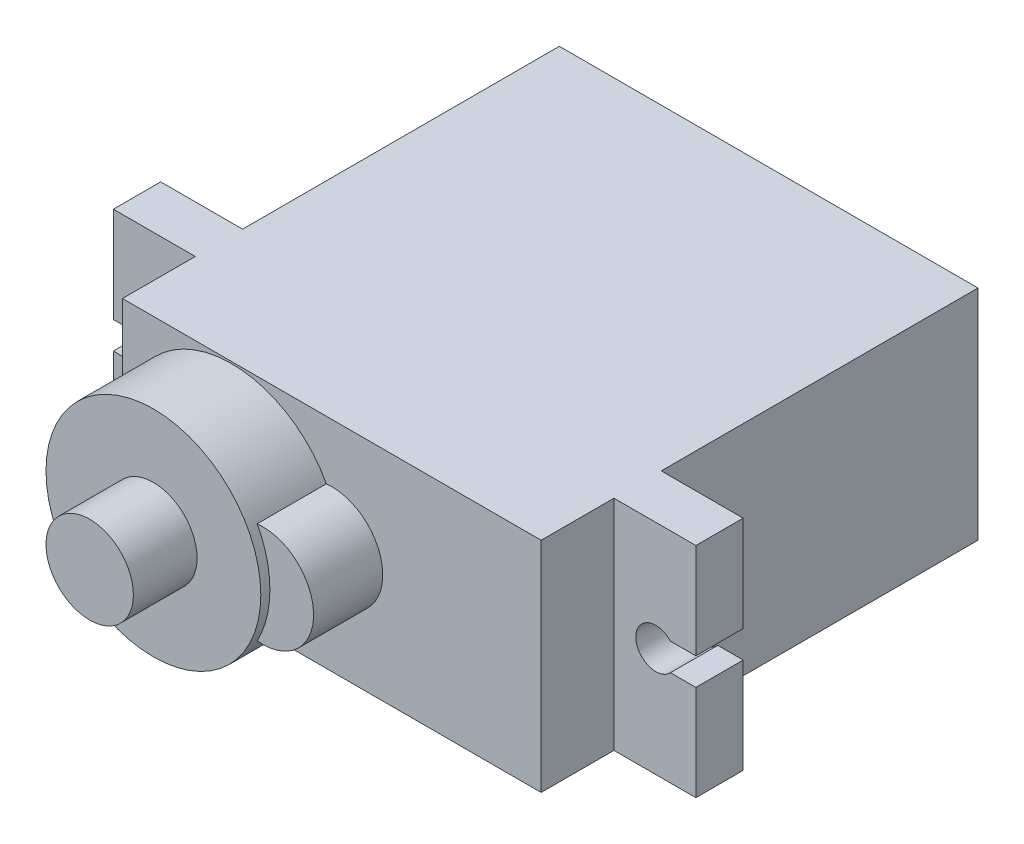
ISO-10303-21;
HEADER;
FILE_DESCRIPTION(('STEP AP214'),'2;1');
FILE_NAME('part.step','',(''),(''),'','','');
FILE_SCHEMA(('AUTOMOTIVE_DESIGN { 1 0 10303 214 1 1 1 1 }'));
ENDSEC;
DATA;
#1=APPLICATION_CONTEXT('core data for automotive mechanical design processes');
#2=APPLICATION_PROTOCOL_DEFINITION('international standard','automotive_design',2000,#1);
#3=PRODUCT_CONTEXT('',#1,'mechanical');
#4=PRODUCT('Part','Part','',(#3));
#5=PRODUCT_RELATED_PRODUCT_CATEGORY('part','',(#4));
#6=PRODUCT_DEFINITION_FORMATION('','',#4);
#7=PRODUCT_DEFINITION_CONTEXT('part definition',#1,'design');
#8=PRODUCT_DEFINITION('design','',#6,#7);
#9=PRODUCT_DEFINITION_SHAPE('','',#8);
#10=(LENGTH_UNIT() NAMED_UNIT(*) SI_UNIT(.MILLI.,.METRE.));
#11=(NAMED_UNIT(*) PLANE_ANGLE_UNIT() SI_UNIT($,.RADIAN.));
#12=(NAMED_UNIT(*) SI_UNIT($,.STERADIAN.) SOLID_ANGLE_UNIT());
#13=UNCERTAINTY_MEASURE_WITH_UNIT(LENGTH_MEASURE(1.E-05),#10,'distance_accuracy_value','');
#14=(GEOMETRIC_REPRESENTATION_CONTEXT(3) GLOBAL_UNCERTAINTY_ASSIGNED_CONTEXT((#13)) GLOBAL_UNIT_ASSIGNED_CONTEXT((#10,
#11,#12)) REPRESENTATION_CONTEXT('',''));
#15=CARTESIAN_POINT('',(0.,0.,0.));
#16=DIRECTION('',(0.,0.,1.));
#17=DIRECTION('',(1.,0.,0.));
#18=AXIS2_PLACEMENT_3D('',#15,#16,#17);
#19=CARTESIAN_POINT('',(0.,0.,31.8));
#20=DIRECTION('',(0.,0.,1.));
#21=DIRECTION('',(1.,0.,0.));
#22=AXIS2_PLACEMENT_3D('',#19,#20,#21);
#23=PLANE('',#22);
#24=CARTESIAN_POINT('',(0.,0.,31.8));
#25=DIRECTION('',(0.,0.,1.));
#26=DIRECTION('',(1.,0.,0.));
#27=AXIS2_PLACEMENT_3D('',#24,#25,#26);
#28=CIRCLE('',#27,2.4);
#29=CARTESIAN_POINT('',(2.4,0.,31.8));
#30=VERTEX_POINT('',#29);
#31=EDGE_CURVE('E11',#30,#30,#28,.T.);
#32=ORIENTED_EDGE('',*,*,#31,.T.);
#33=EDGE_LOOP('',(#32));
#34=FACE_BOUND('',#33,.T.);
#35=ADVANCED_FACE('F17',(#34),#23,.T.);
#36=CARTESIAN_POINT('',(0.,0.,28.3));
#37=DIRECTION('',(0.,0.,1.));
#38=DIRECTION('',(1.,0.,0.));
#39=AXIS2_PLACEMENT_3D('',#36,#37,#38);
#40=CYLINDRICAL_SURFACE('',#39,2.4);
#41=ORIENTED_EDGE('',*,*,#31,.F.);
#42=EDGE_LOOP('',(#41));
#43=FACE_BOUND('',#42,.T.);
#44=CARTESIAN_POINT('',(0.,0.,28.3));
#45=DIRECTION('',(0.,0.,1.));
#46=DIRECTION('',(1.,0.,0.));
#47=AXIS2_PLACEMENT_3D('',#44,#45,#46);
#48=CIRCLE('',#47,2.4);
#49=CARTESIAN_POINT('',(2.4,0.,28.3));
#50=VERTEX_POINT('',#49);
#51=EDGE_CURVE('E26',#50,#50,#48,.T.);
#52=ORIENTED_EDGE('',*,*,#51,.T.);
#53=EDGE_LOOP('',(#52));
#54=FACE_BOUND('',#53,.T.);
#55=ADVANCED_FACE('F610',(#43,#54),#40,.T.);
#56=CARTESIAN_POINT('',(0.,0.,28.3));
#57=DIRECTION('',(0.,0.,1.));
#58=DIRECTION('',(1.,0.,0.));
#59=AXIS2_PLACEMENT_3D('',#56,#57,#58);
#60=PLANE('',#59);
#61=ORIENTED_EDGE('',*,*,#51,.F.);
#62=EDGE_LOOP('',(#61));
#63=FACE_BOUND('',#62,.T.);
#64=CARTESIAN_POINT('',(0.,0.,28.3));
#65=DIRECTION('',(0.,0.,1.));
#66=DIRECTION('',(1.,0.,0.));
#67=AXIS2_PLACEMENT_3D('',#64,#65,#66);
#68=CIRCLE('',#67,5.9);
#69=CARTESIAN_POINT('',(5.9,0.,28.3));
#70=VERTEX_POINT('',#69);
#71=EDGE_CURVE('E445',#70,#70,#68,.T.);
#72=ORIENTED_EDGE('',*,*,#71,.T.);
#73=EDGE_LOOP('',(#72));
#74=FACE_BOUND('',#73,.T.);
#75=ADVANCED_FACE('F616',(#63,#74),#60,.T.);
#76=CARTESIAN_POINT('',(5.5,0.,27.8));
#77=DIRECTION('',(0.,0.,1.));
#78=DIRECTION('',(1.,0.,0.));
#79=AXIS2_PLACEMENT_3D('',#76,#77,#78);
#80=PLANE('',#79);
#81=CARTESIAN_POINT('',(0.,0.,27.8));
#82=DIRECTION('',(0.,0.,1.));
#83=DIRECTION('',(1.,0.,0.));
#84=AXIS2_PLACEMENT_3D('',#81,#82,#83);
#85=CIRCLE('',#84,5.9);
#86=CARTESIAN_POINT('',(5.201818181818,-2.784077513882,27.8));
#87=VERTEX_POINT('',#86);
#88=CARTESIAN_POINT('',(5.201818181818,2.784077513882,27.8));
#89=VERTEX_POINT('',#88);
#90=EDGE_CURVE('E38',#87,#89,#85,.T.);
#91=ORIENTED_EDGE('',*,*,#90,.F.);
#92=CARTESIAN_POINT('',(5.5,0.,27.8));
#93=DIRECTION('',(0.,0.,-1.));
#94=DIRECTION('',(-0.106493506494011,0.9943133978151,0.));
#95=AXIS2_PLACEMENT_3D('',#92,#93,#94);
#96=CIRCLE('',#95,2.8);
#97=EDGE_CURVE('E43',#89,#87,#96,.T.);
#98=ORIENTED_EDGE('',*,*,#97,.F.);
#99=EDGE_LOOP('',(#91,#98));
#100=FACE_BOUND('',#99,.T.);
#101=ADVANCED_FACE('F624',(#100),#80,.T.);
#102=CARTESIAN_POINT('',(19.3,-0.75,16.4));
#103=DIRECTION('',(0.,1.,0.));
#104=DIRECTION('',(1.,0.,0.));
#105=AXIS2_PLACEMENT_3D('',#102,#103,#104);
#106=PLANE('',#105);
#107=DIRECTION('',(-1.,0.,0.));
#108=VECTOR('',#107,1.);
#109=CARTESIAN_POINT('',(4.4,-0.75,20.));
#110=LINE('',#109,#108);
#111=CARTESIAN_POINT('',(21.5,-0.75,20.));
#112=VERTEX_POINT('',#111);
#113=CARTESIAN_POINT('',(20.104673846972,-0.75,20.));
#114=VERTEX_POINT('',#113);
#115=EDGE_CURVE('E438',#112,#114,#110,.T.);
#116=ORIENTED_EDGE('',*,*,#115,.F.);
#117=DIRECTION('',(0.,0.,1.));
#118=VECTOR('',#117,1.);
#119=CARTESIAN_POINT('',(21.5,-0.75,16.9));
#120=LINE('',#119,#118);
#121=CARTESIAN_POINT('',(21.5,-0.75,17.4));
#122=VERTEX_POINT('',#121);
#123=EDGE_CURVE('E387',#122,#112,#120,.T.);
#124=ORIENTED_EDGE('',*,*,#123,.F.);
#125=DIRECTION('',(-1.,0.,0.));
#126=VECTOR('',#125,1.);
#127=CARTESIAN_POINT('',(4.4,-0.75,17.4));
#128=LINE('',#127,#126);
#129=CARTESIAN_POINT('',(20.104673846972,-0.75,17.4));
#130=VERTEX_POINT('',#129);
#131=EDGE_CURVE('E359',#122,#130,#128,.T.);
#132=ORIENTED_EDGE('',*,*,#131,.T.);
#133=DIRECTION('',(0.,0.,-1.));
#134=VECTOR('',#133,1.);
#135=CARTESIAN_POINT('',(20.104673846972,-0.75,16.4));
#136=LINE('',#135,#134);
#137=EDGE_CURVE('E376',#114,#130,#136,.T.);
#138=ORIENTED_EDGE('',*,*,#137,.F.);
#139=EDGE_LOOP('',(#116,#124,#132,#138));
#140=FACE_BOUND('',#139,.T.);
#141=ADVANCED_FACE('F646',(#140),#106,.T.);
#142=CARTESIAN_POINT('',(19.3,0.,16.4));
#143=DIRECTION('',(0.,0.,-1.));
#144=DIRECTION('',(1.,0.,0.));
#145=AXIS2_PLACEMENT_3D('',#142,#143,#144);
#146=CYLINDRICAL_SURFACE('',#145,1.1);
#147=ORIENTED_EDGE('',*,*,#137,.T.);
#148=CARTESIAN_POINT('',(19.3,0.,17.4));
#149=DIRECTION('',(0.,0.,-1.));
#150=DIRECTION('',(1.,0.,0.));
#151=AXIS2_PLACEMENT_3D('',#148,#149,#150);
#152=CIRCLE('',#151,1.1);
#153=CARTESIAN_POINT('',(20.104673846972,0.75,17.4));
#154=VERTEX_POINT('',#153);
#155=EDGE_CURVE('E364',#130,#154,#152,.T.);
#156=ORIENTED_EDGE('',*,*,#155,.T.);
#157=DIRECTION('',(0.,0.,-1.));
#158=VECTOR('',#157,1.);
#159=CARTESIAN_POINT('',(20.104673846972,0.75,16.4));
#160=LINE('',#159,#158);
#161=CARTESIAN_POINT('',(20.104673846972,0.75,20.));
#162=VERTEX_POINT('',#161);
#163=EDGE_CURVE('E20',#162,#154,#160,.T.);
#164=ORIENTED_EDGE('',*,*,#163,.F.);
#165=CARTESIAN_POINT('',(19.3,0.,20.));
#166=DIRECTION('',(0.,0.,-1.));
#167=DIRECTION('',(1.,0.,0.));
#168=AXIS2_PLACEMENT_3D('',#165,#166,#167);
#169=CIRCLE('',#168,1.1);
#170=EDGE_CURVE('E479',#114,#162,#169,.T.);
#171=ORIENTED_EDGE('',*,*,#170,.F.);
#172=EDGE_LOOP('',(#147,#156,#164,#171));
#173=FACE_BOUND('',#172,.T.);
#174=ADVANCED_FACE('F642',(#173),#146,.F.);
#175=CARTESIAN_POINT('',(19.3,0.75,16.4));
#176=DIRECTION('',(0.,1.,0.));
#177=DIRECTION('',(1.,0.,0.));
#178=AXIS2_PLACEMENT_3D('',#175,#176,#177);
#179=PLANE('',#178);
#180=ORIENTED_EDGE('',*,*,#163,.T.);
#181=DIRECTION('',(-1.,0.,0.));
#182=VECTOR('',#181,1.);
#183=CARTESIAN_POINT('',(4.4,0.75,17.4));
#184=LINE('',#183,#182);
#185=CARTESIAN_POINT('',(21.5,0.75,17.4));
#186=VERTEX_POINT('',#185);
#187=EDGE_CURVE('E386',#186,#154,#184,.T.);
#188=ORIENTED_EDGE('',*,*,#187,.F.);
#189=DIRECTION('',(0.,0.,1.));
#190=VECTOR('',#189,1.);
#191=CARTESIAN_POINT('',(21.5,0.75,16.9));
#192=LINE('',#191,#190);
#193=CARTESIAN_POINT('',(21.5,0.75,20.));
#194=VERTEX_POINT('',#193);
#195=EDGE_CURVE('E315',#186,#194,#192,.T.);
#196=ORIENTED_EDGE('',*,*,#195,.T.);
#197=DIRECTION('',(-1.,0.,0.));
#198=VECTOR('',#197,1.);
#199=CARTESIAN_POINT('',(4.4,0.75,20.));
#200=LINE('',#199,#198);
#201=EDGE_CURVE('E414',#194,#162,#200,.T.);
#202=ORIENTED_EDGE('',*,*,#201,.T.);
#203=EDGE_LOOP('',(#180,#188,#196,#202));
#204=FACE_BOUND('',#203,.T.);
#205=ADVANCED_FACE('F637',(#204),#179,.F.);
#206=CARTESIAN_POINT('',(5.5,0.,24.));
#207=DIRECTION('',(0.,0.,1.));
#208=DIRECTION('',(1.,0.,0.));
#209=AXIS2_PLACEMENT_3D('',#206,#207,#208);
#210=CYLINDRICAL_SURFACE('',#209,2.8);
#211=CARTESIAN_POINT('',(5.5,0.,24.));
#212=DIRECTION('',(0.,0.,-1.));
#213=DIRECTION('',(-0.106493506493022,0.994313397815206,0.));
#214=AXIS2_PLACEMENT_3D('',#211,#212,#213);
#215=CIRCLE('',#214,2.8);
#216=CARTESIAN_POINT('',(5.201818181818,2.784077513882,24.));
#217=VERTEX_POINT('',#216);
#218=CARTESIAN_POINT('',(5.201818181818,-2.784077513882,24.));
#219=VERTEX_POINT('',#218);
#220=EDGE_CURVE('E295',#217,#219,#215,.T.);
#221=ORIENTED_EDGE('',*,*,#220,.F.);
#222=DIRECTION('',(0.,0.,1.));
#223=VECTOR('',#222,1.);
#224=CARTESIAN_POINT('',(5.201818181818,2.784077513882,24.));
#225=LINE('',#224,#223);
#226=EDGE_CURVE('E338',#217,#89,#225,.T.);
#227=ORIENTED_EDGE('',*,*,#226,.T.);
#228=ORIENTED_EDGE('',*,*,#97,.T.);
#229=DIRECTION('',(0.,0.,1.));
#230=VECTOR('',#229,1.);
#231=CARTESIAN_POINT('',(5.201818181818,-2.784077513882,24.));
#232=LINE('',#231,#230);
#233=EDGE_CURVE('E337',#219,#87,#232,.T.);
#234=ORIENTED_EDGE('',*,*,#233,.F.);
#235=EDGE_LOOP('',(#221,#227,#228,#234));
#236=FACE_BOUND('',#235,.T.);
#237=ADVANCED_FACE('F555',(#236),#210,.T.);
#238=CARTESIAN_POINT('',(0.,0.,24.));
#239=DIRECTION('',(0.,0.,1.));
#240=DIRECTION('',(1.,0.,0.));
#241=AXIS2_PLACEMENT_3D('',#238,#239,#240);
#242=CYLINDRICAL_SURFACE('',#241,5.9);
#243=ORIENTED_EDGE('',*,*,#71,.F.);
#244=EDGE_LOOP('',(#243));
#245=FACE_BOUND('',#244,.T.);
#246=ORIENTED_EDGE('',*,*,#233,.T.);
#247=ORIENTED_EDGE('',*,*,#90,.T.);
#248=ORIENTED_EDGE('',*,*,#226,.F.);
#249=CARTESIAN_POINT('',(0.,0.,24.));
#250=DIRECTION('',(0.,0.,1.));
#251=DIRECTION('',(1.,0.,0.));
#252=AXIS2_PLACEMENT_3D('',#249,#250,#251);
#253=CIRCLE('',#252,5.9);
#254=EDGE_CURVE('E527',#217,#219,#253,.T.);
#255=ORIENTED_EDGE('',*,*,#254,.T.);
#256=EDGE_LOOP('',(#246,#247,#248,#255));
#257=FACE_BOUND('',#256,.T.);
#258=ADVANCED_FACE('F551',(#245,#257),#242,.T.);
#259=CARTESIAN_POINT('',(-9.25,-2.25,1.5));
#260=DIRECTION('',(1.,0.,0.));
#261=DIRECTION('',(0.,1.,0.));
#262=AXIS2_PLACEMENT_3D('',#259,#260,#261);
#263=PLANE('',#262);
#264=DIRECTION('',(0.,1.,0.));
#265=VECTOR('',#264,1.);
#266=CARTESIAN_POINT('',(-9.25,-2.25,4.5));
#267=LINE('',#266,#265);
#268=CARTESIAN_POINT('',(-9.25,-2.25,4.5));
#269=VERTEX_POINT('',#268);
#270=CARTESIAN_POINT('',(-9.25,2.25,4.5));
#271=VERTEX_POINT('',#270);
#272=EDGE_CURVE('E501',#269,#271,#267,.T.);
#273=ORIENTED_EDGE('',*,*,#272,.T.);
#274=DIRECTION('',(0.,0.,1.));
#275=VECTOR('',#274,1.);
#276=CARTESIAN_POINT('',(-9.25,2.25,1.5));
#277=LINE('',#276,#275);
#278=CARTESIAN_POINT('',(-9.25,2.25,1.5));
#279=VERTEX_POINT('',#278);
#280=EDGE_CURVE('E489',#279,#271,#277,.T.);
#281=ORIENTED_EDGE('',*,*,#280,.F.);
#282=DIRECTION('',(0.,1.,0.));
#283=VECTOR('',#282,1.);
#284=CARTESIAN_POINT('',(-9.25,-2.25,1.5));
#285=LINE('',#284,#283);
#286=CARTESIAN_POINT('',(-9.25,-2.25,1.5));
#287=VERTEX_POINT('',#286);
#288=EDGE_CURVE('E478',#287,#279,#285,.T.);
#289=ORIENTED_EDGE('',*,*,#288,.F.);
#290=DIRECTION('',(0.,0.,1.));
#291=VECTOR('',#290,1.);
#292=CARTESIAN_POINT('',(-9.25,-2.25,1.5));
#293=LINE('',#292,#291);
#294=EDGE_CURVE('E369',#287,#269,#293,.T.);
#295=ORIENTED_EDGE('',*,*,#294,.T.);
#296=EDGE_LOOP('',(#273,#281,#289,#295));
#297=FACE_BOUND('',#296,.T.);
#298=ADVANCED_FACE('F606',(#297),#263,.F.);
#299=CARTESIAN_POINT('',(21.5,-6.,17.4));
#300=DIRECTION('',(1.,0.,0.));
#301=DIRECTION('',(0.,1.,0.));
#302=AXIS2_PLACEMENT_3D('',#299,#300,#301);
#303=PLANE('',#302);
#304=DIRECTION('',(0.,1.,0.));
#305=VECTOR('',#304,1.);
#306=CARTESIAN_POINT('',(21.5,-6.,20.));
#307=LINE('',#306,#305);
#308=CARTESIAN_POINT('',(21.5,6.,20.));
#309=VERTEX_POINT('',#308);
#310=EDGE_CURVE('E411',#194,#309,#307,.T.);
#311=ORIENTED_EDGE('',*,*,#310,.F.);
#312=ORIENTED_EDGE('',*,*,#195,.F.);
#313=DIRECTION('',(0.,1.,0.));
#314=VECTOR('',#313,1.);
#315=CARTESIAN_POINT('',(21.5,-6.,17.4));
#316=LINE('',#315,#314);
#317=CARTESIAN_POINT('',(21.5,6.,17.4));
#318=VERTEX_POINT('',#317);
#319=EDGE_CURVE('E383',#186,#318,#316,.T.);
#320=ORIENTED_EDGE('',*,*,#319,.T.);
#321=DIRECTION('',(0.,0.,1.));
#322=VECTOR('',#321,1.);
#323=CARTESIAN_POINT('',(21.5,6.,17.4));
#324=LINE('',#323,#322);
#325=EDGE_CURVE('E460',#318,#309,#324,.T.);
#326=ORIENTED_EDGE('',*,*,#325,.T.);
#327=EDGE_LOOP('',(#311,#312,#320,#326));
#328=FACE_BOUND('',#327,.T.);
#329=ADVANCED_FACE('F597',(#328),#303,.T.);
#330=CARTESIAN_POINT('',(-10.5,-6.,17.4));
#331=DIRECTION('',(1.,0.,0.));
#332=DIRECTION('',(0.,1.,0.));
#333=AXIS2_PLACEMENT_3D('',#330,#331,#332);
#334=PLANE('',#333);
#335=DIRECTION('',(0.,0.,1.));
#336=VECTOR('',#335,1.);
#337=CARTESIAN_POINT('',(-10.5,6.,17.4));
#338=LINE('',#337,#336);
#339=CARTESIAN_POINT('',(-10.5,6.,17.4));
#340=VERTEX_POINT('',#339);
#341=CARTESIAN_POINT('',(-10.5,6.,20.));
#342=VERTEX_POINT('',#341);
#343=EDGE_CURVE('E302',#340,#342,#338,.T.);
#344=ORIENTED_EDGE('',*,*,#343,.F.);
#345=DIRECTION('',(0.,1.,0.));
#346=VECTOR('',#345,1.);
#347=CARTESIAN_POINT('',(-10.5,-6.,17.4));
#348=LINE('',#347,#346);
#349=CARTESIAN_POINT('',(-10.5,0.75,17.4));
#350=VERTEX_POINT('',#349);
#351=EDGE_CURVE('E258',#350,#340,#348,.T.);
#352=ORIENTED_EDGE('',*,*,#351,.F.);
#353=DIRECTION('',(0.,0.,1.));
#354=VECTOR('',#353,1.);
#355=CARTESIAN_POINT('',(-10.5,0.75,16.9));
#356=LINE('',#355,#354);
#357=CARTESIAN_POINT('',(-10.5,0.75,20.));
#358=VERTEX_POINT('',#357);
#359=EDGE_CURVE('E312',#350,#358,#356,.T.);
#360=ORIENTED_EDGE('',*,*,#359,.T.);
#361=DIRECTION('',(0.,1.,0.));
#362=VECTOR('',#361,1.);
#363=CARTESIAN_POINT('',(-10.5,-6.,20.));
#364=LINE('',#363,#362);
#365=EDGE_CURVE('E415',#358,#342,#364,.T.);
#366=ORIENTED_EDGE('',*,*,#365,.T.);
#367=EDGE_LOOP('',(#344,#352,#360,#366));
#368=FACE_BOUND('',#367,.T.);
#369=ADVANCED_FACE('F595',(#368),#334,.F.);
#370=CARTESIAN_POINT('',(-12.7,0.75,16.4));
#371=DIRECTION('',(0.,1.,0.));
#372=DIRECTION('',(1.,0.,0.));
#373=AXIS2_PLACEMENT_3D('',#370,#371,#372);
#374=PLANE('',#373);
#375=DIRECTION('',(0.,0.,-1.));
#376=VECTOR('',#375,1.);
#377=CARTESIAN_POINT('',(-9.104673846972,0.75,16.4));
#378=LINE('',#377,#376);
#379=CARTESIAN_POINT('',(-9.104673846972,0.75,20.));
#380=VERTEX_POINT('',#379);
#381=CARTESIAN_POINT('',(-9.104673846972,0.75,17.4));
#382=VERTEX_POINT('',#381);
#383=EDGE_CURVE('E316',#380,#382,#378,.T.);
#384=ORIENTED_EDGE('',*,*,#383,.F.);
#385=DIRECTION('',(-1.,0.,0.));
#386=VECTOR('',#385,1.);
#387=CARTESIAN_POINT('',(-11.6,0.75,20.));
#388=LINE('',#387,#386);
#389=EDGE_CURVE('E322',#380,#358,#388,.T.);
#390=ORIENTED_EDGE('',*,*,#389,.T.);
#391=ORIENTED_EDGE('',*,*,#359,.F.);
#392=DIRECTION('',(-1.,0.,0.));
#393=VECTOR('',#392,1.);
#394=CARTESIAN_POINT('',(-11.6,0.75,17.4));
#395=LINE('',#394,#393);
#396=EDGE_CURVE('E379',#382,#350,#395,.T.);
#397=ORIENTED_EDGE('',*,*,#396,.F.);
#398=EDGE_LOOP('',(#384,#390,#391,#397));
#399=FACE_BOUND('',#398,.T.);
#400=ADVANCED_FACE('F593',(#399),#374,.F.);
#401=CARTESIAN_POINT('',(-8.3,0.,16.4));
#402=DIRECTION('',(0.,0.,-1.));
#403=DIRECTION('',(1.,0.,0.));
#404=AXIS2_PLACEMENT_3D('',#401,#402,#403);
#405=CYLINDRICAL_SURFACE('',#404,1.1);
#406=CARTESIAN_POINT('',(-8.3,0.,20.));
#407=DIRECTION('',(0.,0.,-1.));
#408=DIRECTION('',(-0.731521679065117,0.681818181818109,0.));
#409=AXIS2_PLACEMENT_3D('',#406,#407,#408);
#410=CIRCLE('',#409,1.1);
#411=CARTESIAN_POINT('',(-9.104673846972,-0.75,20.));
#412=VERTEX_POINT('',#411);
#413=EDGE_CURVE('E317',#380,#412,#410,.T.);
#414=ORIENTED_EDGE('',*,*,#413,.F.);
#415=ORIENTED_EDGE('',*,*,#383,.T.);
#416=CARTESIAN_POINT('',(-8.3,0.,17.4));
#417=DIRECTION('',(0.,0.,1.));
#418=DIRECTION('',(-0.731521679065117,-0.681818181818109,0.));
#419=AXIS2_PLACEMENT_3D('',#416,#417,#418);
#420=CIRCLE('',#419,1.1);
#421=CARTESIAN_POINT('',(-9.104673846972,-0.75,17.4));
#422=VERTEX_POINT('',#421);
#423=EDGE_CURVE('E422',#422,#382,#420,.T.);
#424=ORIENTED_EDGE('',*,*,#423,.F.);
#425=DIRECTION('',(0.,0.,-1.));
#426=VECTOR('',#425,1.);
#427=CARTESIAN_POINT('',(-9.104673846972,-0.75,16.4));
#428=LINE('',#427,#426);
#429=EDGE_CURVE('E363',#412,#422,#428,.T.);
#430=ORIENTED_EDGE('',*,*,#429,.F.);
#431=EDGE_LOOP('',(#414,#415,#424,#430));
#432=FACE_BOUND('',#431,.T.);
#433=ADVANCED_FACE('F590',(#432),#405,.F.);
#434=CARTESIAN_POINT('',(-12.7,-0.75,16.4));
#435=DIRECTION('',(0.,1.,0.));
#436=DIRECTION('',(1.,0.,0.));
#437=AXIS2_PLACEMENT_3D('',#434,#435,#436);
#438=PLANE('',#437);
#439=DIRECTION('',(-1.,0.,0.));
#440=VECTOR('',#439,1.);
#441=CARTESIAN_POINT('',(-11.6,-0.75,17.4));
#442=LINE('',#441,#440);
#443=CARTESIAN_POINT('',(-10.5,-0.75,17.4));
#444=VERTEX_POINT('',#443);
#445=EDGE_CURVE('E407',#422,#444,#442,.T.);
#446=ORIENTED_EDGE('',*,*,#445,.T.);
#447=DIRECTION('',(0.,0.,1.));
#448=VECTOR('',#447,1.);
#449=CARTESIAN_POINT('',(-10.5,-0.75,16.9));
#450=LINE('',#449,#448);
#451=CARTESIAN_POINT('',(-10.5,-0.75,20.));
#452=VERTEX_POINT('',#451);
#453=EDGE_CURVE('E368',#444,#452,#450,.T.);
#454=ORIENTED_EDGE('',*,*,#453,.T.);
#455=DIRECTION('',(-1.,0.,0.));
#456=VECTOR('',#455,1.);
#457=CARTESIAN_POINT('',(-11.6,-0.75,20.));
#458=LINE('',#457,#456);
#459=EDGE_CURVE('E321',#412,#452,#458,.T.);
#460=ORIENTED_EDGE('',*,*,#459,.F.);
#461=ORIENTED_EDGE('',*,*,#429,.T.);
#462=EDGE_LOOP('',(#446,#454,#460,#461));
#463=FACE_BOUND('',#462,.T.);
#464=ADVANCED_FACE('F585',(#463),#438,.T.);
#465=CARTESIAN_POINT('',(-10.5,-6.,17.4));
#466=DIRECTION('',(0.,0.,1.));
#467=DIRECTION('',(1.,0.,0.));
#468=AXIS2_PLACEMENT_3D('',#465,#466,#467);
#469=PLANE('',#468);
#470=DIRECTION('',(1.,0.,0.));
#471=VECTOR('',#470,1.);
#472=CARTESIAN_POINT('',(-10.5,6.,17.4));
#473=LINE('',#472,#471);
#474=CARTESIAN_POINT('',(17.,6.,17.4));
#475=VERTEX_POINT('',#474);
#476=EDGE_CURVE('E467',#475,#318,#473,.T.);
#477=ORIENTED_EDGE('',*,*,#476,.T.);
#478=ORIENTED_EDGE('',*,*,#319,.F.);
#479=ORIENTED_EDGE('',*,*,#187,.T.);
#480=ORIENTED_EDGE('',*,*,#155,.F.);
#481=ORIENTED_EDGE('',*,*,#131,.F.);
#482=DIRECTION('',(0.,1.,0.));
#483=VECTOR('',#482,1.);
#484=CARTESIAN_POINT('',(21.5,-6.,17.4));
#485=LINE('',#484,#483);
#486=CARTESIAN_POINT('',(21.5,-6.,17.4));
#487=VERTEX_POINT('',#486);
#488=EDGE_CURVE('E410',#487,#122,#485,.T.);
#489=ORIENTED_EDGE('',*,*,#488,.F.);
#490=DIRECTION('',(1.,0.,0.));
#491=VECTOR('',#490,1.);
#492=CARTESIAN_POINT('',(-10.5,-6.,17.4));
#493=LINE('',#492,#491);
#494=CARTESIAN_POINT('',(17.,-6.,17.4));
#495=VERTEX_POINT('',#494);
#496=EDGE_CURVE('E288',#495,#487,#493,.T.);
#497=ORIENTED_EDGE('',*,*,#496,.F.);
#498=DIRECTION('',(0.,-1.,0.));
#499=VECTOR('',#498,1.);
#500=CARTESIAN_POINT('',(17.,-6.,17.4));
#501=LINE('',#500,#499);
#502=EDGE_CURVE('E365',#475,#495,#501,.T.);
#503=ORIENTED_EDGE('',*,*,#502,.F.);
#504=EDGE_LOOP('',(#477,#478,#479,#480,#481,#489,#497,#503));
#505=FACE_BOUND('',#504,.T.);
#506=ADVANCED_FACE('F665',(#505),#469,.F.);
#507=CARTESIAN_POINT('',(21.5,-6.,17.4));
#508=DIRECTION('',(1.,0.,0.));
#509=DIRECTION('',(0.,1.,0.));
#510=AXIS2_PLACEMENT_3D('',#507,#508,#509);
#511=PLANE('',#510);
#512=DIRECTION('',(0.,1.,0.));
#513=VECTOR('',#512,1.);
#514=CARTESIAN_POINT('',(21.5,-6.,20.));
#515=LINE('',#514,#513);
#516=CARTESIAN_POINT('',(21.5,-6.,20.));
#517=VERTEX_POINT('',#516);
#518=EDGE_CURVE('E294',#517,#112,#515,.T.);
#519=ORIENTED_EDGE('',*,*,#518,.F.);
#520=DIRECTION('',(0.,0.,1.));
#521=VECTOR('',#520,1.);
#522=CARTESIAN_POINT('',(21.5,-6.,17.4));
#523=LINE('',#522,#521);
#524=EDGE_CURVE('E347',#487,#517,#523,.T.);
#525=ORIENTED_EDGE('',*,*,#524,.F.);
#526=ORIENTED_EDGE('',*,*,#488,.T.);
#527=ORIENTED_EDGE('',*,*,#123,.T.);
#528=EDGE_LOOP('',(#519,#525,#526,#527));
#529=FACE_BOUND('',#528,.T.);
#530=ADVANCED_FACE('F662',(#529),#511,.T.);
#531=CARTESIAN_POINT('',(-10.5,-6.,20.));
#532=DIRECTION('',(0.,0.,1.));
#533=DIRECTION('',(1.,0.,0.));
#534=AXIS2_PLACEMENT_3D('',#531,#532,#533);
#535=PLANE('',#534);
#536=DIRECTION('',(0.,-1.,0.));
#537=VECTOR('',#536,1.);
#538=CARTESIAN_POINT('',(17.,-6.,20.));
#539=LINE('',#538,#537);
#540=CARTESIAN_POINT('',(17.,6.,20.));
#541=VERTEX_POINT('',#540);
#542=CARTESIAN_POINT('',(17.,-6.,20.));
#543=VERTEX_POINT('',#542);
#544=EDGE_CURVE('E291',#541,#543,#539,.T.);
#545=ORIENTED_EDGE('',*,*,#544,.T.);
#546=DIRECTION('',(1.,0.,0.));
#547=VECTOR('',#546,1.);
#548=CARTESIAN_POINT('',(-10.5,-6.,20.));
#549=LINE('',#548,#547);
#550=EDGE_CURVE('E352',#543,#517,#549,.T.);
#551=ORIENTED_EDGE('',*,*,#550,.T.);
#552=ORIENTED_EDGE('',*,*,#518,.T.);
#553=ORIENTED_EDGE('',*,*,#115,.T.);
#554=ORIENTED_EDGE('',*,*,#170,.T.);
#555=ORIENTED_EDGE('',*,*,#201,.F.);
#556=ORIENTED_EDGE('',*,*,#310,.T.);
#557=DIRECTION('',(1.,0.,0.));
#558=VECTOR('',#557,1.);
#559=CARTESIAN_POINT('',(-10.5,6.,20.));
#560=LINE('',#559,#558);
#561=EDGE_CURVE('E453',#541,#309,#560,.T.);
#562=ORIENTED_EDGE('',*,*,#561,.F.);
#563=EDGE_LOOP('',(#545,#551,#552,#553,#554,#555,#556,#562));
#564=FACE_BOUND('',#563,.T.);
#565=ADVANCED_FACE('F659',(#564),#535,.T.);
#566=CARTESIAN_POINT('',(17.,-6.,0.));
#567=DIRECTION('',(1.,0.,0.));
#568=DIRECTION('',(0.,1.,0.));
#569=AXIS2_PLACEMENT_3D('',#566,#567,#568);
#570=PLANE('',#569);
#571=DIRECTION('',(0.,0.,1.));
#572=VECTOR('',#571,1.);
#573=CARTESIAN_POINT('',(17.,-6.,0.));
#574=LINE('',#573,#572);
#575=CARTESIAN_POINT('',(17.,-6.,24.));
#576=VERTEX_POINT('',#575);
#577=EDGE_CURVE('E348',#543,#576,#574,.T.);
#578=ORIENTED_EDGE('',*,*,#577,.F.);
#579=ORIENTED_EDGE('',*,*,#544,.F.);
#580=DIRECTION('',(0.,0.,1.));
#581=VECTOR('',#580,1.);
#582=CARTESIAN_POINT('',(17.,6.,0.));
#583=LINE('',#582,#581);
#584=CARTESIAN_POINT('',(17.,6.,24.));
#585=VERTEX_POINT('',#584);
#586=EDGE_CURVE('E449',#541,#585,#583,.T.);
#587=ORIENTED_EDGE('',*,*,#586,.T.);
#588=DIRECTION('',(0.,1.,0.));
#589=VECTOR('',#588,1.);
#590=CARTESIAN_POINT('',(17.,-6.,24.));
#591=LINE('',#590,#589);
#592=EDGE_CURVE('E471',#576,#585,#591,.T.);
#593=ORIENTED_EDGE('',*,*,#592,.F.);
#594=EDGE_LOOP('',(#578,#579,#587,#593));
#595=FACE_BOUND('',#594,.T.);
#596=ADVANCED_FACE('F561',(#595),#570,.T.);
#597=CARTESIAN_POINT('',(-6.,-6.,24.));
#598=DIRECTION('',(0.,0.,1.));
#599=DIRECTION('',(1.,0.,0.));
#600=AXIS2_PLACEMENT_3D('',#597,#598,#599);
#601=PLANE('',#600);
#602=ORIENTED_EDGE('',*,*,#254,.F.);
#603=ORIENTED_EDGE('',*,*,#220,.T.);
#604=EDGE_LOOP('',(#602,#603));
#605=FACE_BOUND('',#604,.T.);
#606=DIRECTION('',(0.,1.,0.));
#607=VECTOR('',#606,1.);
#608=CARTESIAN_POINT('',(-6.,-6.,24.));
#609=LINE('',#608,#607);
#610=CARTESIAN_POINT('',(-6.,-6.,24.));
#611=VERTEX_POINT('',#610);
#612=CARTESIAN_POINT('',(-6.,6.,24.));
#613=VERTEX_POINT('',#612);
#614=EDGE_CURVE('E468',#611,#613,#609,.T.);
#615=ORIENTED_EDGE('',*,*,#614,.F.);
#616=DIRECTION('',(1.,0.,0.));
#617=VECTOR('',#616,1.);
#618=CARTESIAN_POINT('',(-6.,-6.,24.));
#619=LINE('',#618,#617);
#620=EDGE_CURVE('E331',#611,#576,#619,.T.);
#621=ORIENTED_EDGE('',*,*,#620,.T.);
#622=ORIENTED_EDGE('',*,*,#592,.T.);
#623=DIRECTION('',(1.,0.,0.));
#624=VECTOR('',#623,1.);
#625=CARTESIAN_POINT('',(-6.,6.,24.));
#626=LINE('',#625,#624);
#627=EDGE_CURVE('E442',#613,#585,#626,.T.);
#628=ORIENTED_EDGE('',*,*,#627,.F.);
#629=EDGE_LOOP('',(#615,#621,#622,#628));
#630=FACE_BOUND('',#629,.T.);
#631=ADVANCED_FACE('F557',(#605,#630),#601,.T.);
#632=CARTESIAN_POINT('',(-6.,-6.,0.));
#633=DIRECTION('',(1.,0.,0.));
#634=DIRECTION('',(0.,1.,0.));
#635=AXIS2_PLACEMENT_3D('',#632,#633,#634);
#636=PLANE('',#635);
#637=ORIENTED_EDGE('',*,*,#614,.T.);
#638=DIRECTION('',(0.,0.,1.));
#639=VECTOR('',#638,1.);
#640=CARTESIAN_POINT('',(-6.,6.,0.));
#641=LINE('',#640,#639);
#642=CARTESIAN_POINT('',(-6.,6.,20.));
#643=VERTEX_POINT('',#642);
#644=EDGE_CURVE('E429',#643,#613,#641,.T.);
#645=ORIENTED_EDGE('',*,*,#644,.F.);
#646=DIRECTION('',(0.,-1.,0.));
#647=VECTOR('',#646,1.);
#648=CARTESIAN_POINT('',(-6.,-6.,20.));
#649=LINE('',#648,#647);
#650=CARTESIAN_POINT('',(-6.,-6.,20.));
#651=VERTEX_POINT('',#650);
#652=EDGE_CURVE('E418',#643,#651,#649,.T.);
#653=ORIENTED_EDGE('',*,*,#652,.T.);
#654=DIRECTION('',(0.,0.,1.));
#655=VECTOR('',#654,1.);
#656=CARTESIAN_POINT('',(-6.,-6.,0.));
#657=LINE('',#656,#655);
#658=EDGE_CURVE('E327',#651,#611,#657,.T.);
#659=ORIENTED_EDGE('',*,*,#658,.T.);
#660=EDGE_LOOP('',(#637,#645,#653,#659));
#661=FACE_BOUND('',#660,.T.);
#662=ADVANCED_FACE('F560',(#661),#636,.F.);
#663=CARTESIAN_POINT('',(-10.5,-6.,20.));
#664=DIRECTION('',(0.,0.,1.));
#665=DIRECTION('',(1.,0.,0.));
#666=AXIS2_PLACEMENT_3D('',#663,#664,#665);
#667=PLANE('',#666);
#668=DIRECTION('',(0.,1.,0.));
#669=VECTOR('',#668,1.);
#670=CARTESIAN_POINT('',(-10.5,-6.,20.));
#671=LINE('',#670,#669);
#672=CARTESIAN_POINT('',(-10.5,-6.,20.));
#673=VERTEX_POINT('',#672);
#674=EDGE_CURVE('E517',#673,#452,#671,.T.);
#675=ORIENTED_EDGE('',*,*,#674,.F.);
#676=DIRECTION('',(1.,0.,0.));
#677=VECTOR('',#676,1.);
#678=CARTESIAN_POINT('',(-10.5,-6.,20.));
#679=LINE('',#678,#677);
#680=EDGE_CURVE('E311',#673,#651,#679,.T.);
#681=ORIENTED_EDGE('',*,*,#680,.T.);
#682=ORIENTED_EDGE('',*,*,#652,.F.);
#683=DIRECTION('',(1.,0.,0.));
#684=VECTOR('',#683,1.);
#685=CARTESIAN_POINT('',(-10.5,6.,20.));
#686=LINE('',#685,#684);
#687=EDGE_CURVE('E355',#342,#643,#686,.T.);
#688=ORIENTED_EDGE('',*,*,#687,.F.);
#689=ORIENTED_EDGE('',*,*,#365,.F.);
#690=ORIENTED_EDGE('',*,*,#389,.F.);
#691=ORIENTED_EDGE('',*,*,#413,.T.);
#692=ORIENTED_EDGE('',*,*,#459,.T.);
#693=EDGE_LOOP('',(#675,#681,#682,#688,#689,#690,#691,#692));
#694=FACE_BOUND('',#693,.T.);
#695=ADVANCED_FACE('F579',(#694),#667,.T.);
#696=CARTESIAN_POINT('',(-10.5,-6.,17.4));
#697=DIRECTION('',(1.,0.,0.));
#698=DIRECTION('',(0.,1.,0.));
#699=AXIS2_PLACEMENT_3D('',#696,#697,#698);
#700=PLANE('',#699);
#701=ORIENTED_EDGE('',*,*,#453,.F.);
#702=DIRECTION('',(0.,1.,0.));
#703=VECTOR('',#702,1.);
#704=CARTESIAN_POINT('',(-10.5,-6.,17.4));
#705=LINE('',#704,#703);
#706=CARTESIAN_POINT('',(-10.5,-6.,17.4));
#707=VERTEX_POINT('',#706);
#708=EDGE_CURVE('E262',#707,#444,#705,.T.);
#709=ORIENTED_EDGE('',*,*,#708,.F.);
#710=DIRECTION('',(0.,0.,1.));
#711=VECTOR('',#710,1.);
#712=CARTESIAN_POINT('',(-10.5,-6.,17.4));
#713=LINE('',#712,#711);
#714=EDGE_CURVE('E306',#707,#673,#713,.T.);
#715=ORIENTED_EDGE('',*,*,#714,.T.);
#716=ORIENTED_EDGE('',*,*,#674,.T.);
#717=EDGE_LOOP('',(#701,#709,#715,#716));
#718=FACE_BOUND('',#717,.T.);
#719=ADVANCED_FACE('F583',(#718),#700,.F.);
#720=CARTESIAN_POINT('',(17.,-6.,0.));
#721=DIRECTION('',(1.,0.,0.));
#722=DIRECTION('',(0.,1.,0.));
#723=AXIS2_PLACEMENT_3D('',#720,#721,#722);
#724=PLANE('',#723);
#725=DIRECTION('',(0.,0.,1.));
#726=VECTOR('',#725,1.);
#727=CARTESIAN_POINT('',(17.,-6.,0.));
#728=LINE('',#727,#726);
#729=CARTESIAN_POINT('',(17.,-6.,0.));
#730=VERTEX_POINT('',#729);
#731=EDGE_CURVE('E397',#730,#495,#728,.T.);
#732=ORIENTED_EDGE('',*,*,#731,.F.);
#733=DIRECTION('',(0.,1.,0.));
#734=VECTOR('',#733,1.);
#735=CARTESIAN_POINT('',(17.,-6.,0.));
#736=LINE('',#735,#734);
#737=CARTESIAN_POINT('',(17.,6.,0.));
#738=VERTEX_POINT('',#737);
#739=EDGE_CURVE('E403',#730,#738,#736,.T.);
#740=ORIENTED_EDGE('',*,*,#739,.T.);
#741=DIRECTION('',(0.,0.,1.));
#742=VECTOR('',#741,1.);
#743=CARTESIAN_POINT('',(17.,6.,0.));
#744=LINE('',#743,#742);
#745=EDGE_CURVE('E298',#738,#475,#744,.T.);
#746=ORIENTED_EDGE('',*,*,#745,.T.);
#747=ORIENTED_EDGE('',*,*,#502,.T.);
#748=EDGE_LOOP('',(#732,#740,#746,#747));
#749=FACE_BOUND('',#748,.T.);
#750=ADVANCED_FACE('F675',(#749),#724,.T.);
#751=CARTESIAN_POINT('',(-9.25,-2.25,1.5));
#752=DIRECTION('',(0.,1.,0.));
#753=DIRECTION('',(1.,0.,0.));
#754=AXIS2_PLACEMENT_3D('',#751,#752,#753);
#755=PLANE('',#754);
#756=DIRECTION('',(0.,0.,1.));
#757=VECTOR('',#756,1.);
#758=CARTESIAN_POINT('',(-6.,-2.25,0.75));
#759=LINE('',#758,#757);
#760=CARTESIAN_POINT('',(-6.,-2.25,1.5));
#761=VERTEX_POINT('',#760);
#762=CARTESIAN_POINT('',(-6.,-2.25,4.5));
#763=VERTEX_POINT('',#762);
#764=EDGE_CURVE('E289',#761,#763,#759,.T.);
#765=ORIENTED_EDGE('',*,*,#764,.T.);
#766=DIRECTION('',(1.,0.,0.));
#767=VECTOR('',#766,1.);
#768=CARTESIAN_POINT('',(-9.25,-2.25,4.5));
#769=LINE('',#768,#767);
#770=EDGE_CURVE('E509',#269,#763,#769,.T.);
#771=ORIENTED_EDGE('',*,*,#770,.F.);
#772=ORIENTED_EDGE('',*,*,#294,.F.);
#773=DIRECTION('',(1.,0.,0.));
#774=VECTOR('',#773,1.);
#775=CARTESIAN_POINT('',(-9.25,-2.25,1.5));
#776=LINE('',#775,#774);
#777=EDGE_CURVE('E475',#287,#761,#776,.T.);
#778=ORIENTED_EDGE('',*,*,#777,.T.);
#779=EDGE_LOOP('',(#765,#771,#772,#778));
#780=FACE_BOUND('',#779,.T.);
#781=ADVANCED_FACE('F694',(#780),#755,.F.);
#782=CARTESIAN_POINT('',(-9.25,-2.25,4.5));
#783=DIRECTION('',(0.,0.,1.));
#784=DIRECTION('',(1.,0.,0.));
#785=AXIS2_PLACEMENT_3D('',#782,#783,#784);
#786=PLANE('',#785);
#787=DIRECTION('',(1.,0.,0.));
#788=VECTOR('',#787,1.);
#789=CARTESIAN_POINT('',(-9.25,2.25,4.5));
#790=LINE('',#789,#788);
#791=CARTESIAN_POINT('',(-6.,2.25,4.5));
#792=VERTEX_POINT('',#791);
#793=EDGE_CURVE('E498',#271,#792,#790,.T.);
#794=ORIENTED_EDGE('',*,*,#793,.F.);
#795=ORIENTED_EDGE('',*,*,#272,.F.);
#796=ORIENTED_EDGE('',*,*,#770,.T.);
#797=DIRECTION('',(0.,-1.,0.));
#798=VECTOR('',#797,1.);
#799=CARTESIAN_POINT('',(-6.,-4.125,4.5));
#800=LINE('',#799,#798);
#801=EDGE_CURVE('E326',#792,#763,#800,.T.);
#802=ORIENTED_EDGE('',*,*,#801,.F.);
#803=EDGE_LOOP('',(#794,#795,#796,#802));
#804=FACE_BOUND('',#803,.T.);
#805=ADVANCED_FACE('F699',(#804),#786,.T.);
#806=CARTESIAN_POINT('',(-9.25,2.25,1.5));
#807=DIRECTION('',(0.,1.,0.));
#808=DIRECTION('',(1.,0.,0.));
#809=AXIS2_PLACEMENT_3D('',#806,#807,#808);
#810=PLANE('',#809);
#811=DIRECTION('',(1.,0.,0.));
#812=VECTOR('',#811,1.);
#813=CARTESIAN_POINT('',(-9.25,2.25,1.5));
#814=LINE('',#813,#812);
#815=CARTESIAN_POINT('',(-6.,2.25,1.5));
#816=VERTEX_POINT('',#815);
#817=EDGE_CURVE('E486',#279,#816,#814,.T.);
#818=ORIENTED_EDGE('',*,*,#817,.F.);
#819=ORIENTED_EDGE('',*,*,#280,.T.);
#820=ORIENTED_EDGE('',*,*,#793,.T.);
#821=DIRECTION('',(0.,0.,1.));
#822=VECTOR('',#821,1.);
#823=CARTESIAN_POINT('',(-6.,2.25,0.75));
#824=LINE('',#823,#822);
#825=EDGE_CURVE('E305',#816,#792,#824,.T.);
#826=ORIENTED_EDGE('',*,*,#825,.F.);
#827=EDGE_LOOP('',(#818,#819,#820,#826));
#828=FACE_BOUND('',#827,.T.);
#829=ADVANCED_FACE('F695',(#828),#810,.T.);
#830=CARTESIAN_POINT('',(-9.25,-2.25,1.5));
#831=DIRECTION('',(0.,0.,1.));
#832=DIRECTION('',(1.,0.,0.));
#833=AXIS2_PLACEMENT_3D('',#830,#831,#832);
#834=PLANE('',#833);
#835=DIRECTION('',(0.,-1.,0.));
#836=VECTOR('',#835,1.);
#837=CARTESIAN_POINT('',(-6.,-4.125,1.5));
#838=LINE('',#837,#836);
#839=EDGE_CURVE('E285',#816,#761,#838,.T.);
#840=ORIENTED_EDGE('',*,*,#839,.T.);
#841=ORIENTED_EDGE('',*,*,#777,.F.);
#842=ORIENTED_EDGE('',*,*,#288,.T.);
#843=ORIENTED_EDGE('',*,*,#817,.T.);
#844=EDGE_LOOP('',(#840,#841,#842,#843));
#845=FACE_BOUND('',#844,.T.);
#846=ADVANCED_FACE('F698',(#845),#834,.F.);
#847=CARTESIAN_POINT('',(-6.,6.,0.));
#848=DIRECTION('',(0.,1.,0.));
#849=DIRECTION('',(1.,0.,0.));
#850=AXIS2_PLACEMENT_3D('',#847,#848,#849);
#851=PLANE('',#850);
#852=ORIENTED_EDGE('',*,*,#745,.F.);
#853=DIRECTION('',(1.,0.,0.));
#854=VECTOR('',#853,1.);
#855=CARTESIAN_POINT('',(-6.,6.,0.));
#856=LINE('',#855,#854);
#857=CARTESIAN_POINT('',(-6.,6.,0.));
#858=VERTEX_POINT('',#857);
#859=EDGE_CURVE('E268',#858,#738,#856,.T.);
#860=ORIENTED_EDGE('',*,*,#859,.F.);
#861=DIRECTION('',(0.,0.,1.));
#862=VECTOR('',#861,1.);
#863=CARTESIAN_POINT('',(-6.,6.,0.));
#864=LINE('',#863,#862);
#865=CARTESIAN_POINT('',(-6.,6.,17.4));
#866=VERTEX_POINT('',#865);
#867=EDGE_CURVE('E265',#858,#866,#864,.T.);
#868=ORIENTED_EDGE('',*,*,#867,.T.);
#869=DIRECTION('',(1.,0.,0.));
#870=VECTOR('',#869,1.);
#871=CARTESIAN_POINT('',(-10.5,6.,17.4));
#872=LINE('',#871,#870);
#873=EDGE_CURVE('E249',#340,#866,#872,.T.);
#874=ORIENTED_EDGE('',*,*,#873,.F.);
#875=ORIENTED_EDGE('',*,*,#343,.T.);
#876=ORIENTED_EDGE('',*,*,#687,.T.);
#877=ORIENTED_EDGE('',*,*,#644,.T.);
#878=ORIENTED_EDGE('',*,*,#627,.T.);
#879=ORIENTED_EDGE('',*,*,#586,.F.);
#880=ORIENTED_EDGE('',*,*,#561,.T.);
#881=ORIENTED_EDGE('',*,*,#325,.F.);
#882=ORIENTED_EDGE('',*,*,#476,.F.);
#883=EDGE_LOOP('',(#852,#860,#868,#874,#875,#876,#877,#878,#879,#880,#881,#882));
#884=FACE_BOUND('',#883,.T.);
#885=ADVANCED_FACE('F266',(#884),#851,.T.);
#886=CARTESIAN_POINT('',(-10.5,-6.,17.4));
#887=DIRECTION('',(0.,0.,1.));
#888=DIRECTION('',(1.,0.,0.));
#889=AXIS2_PLACEMENT_3D('',#886,#887,#888);
#890=PLANE('',#889);
#891=ORIENTED_EDGE('',*,*,#445,.F.);
#892=ORIENTED_EDGE('',*,*,#423,.T.);
#893=ORIENTED_EDGE('',*,*,#396,.T.);
#894=ORIENTED_EDGE('',*,*,#351,.T.);
#895=ORIENTED_EDGE('',*,*,#873,.T.);
#896=DIRECTION('',(0.,-1.,0.));
#897=VECTOR('',#896,1.);
#898=CARTESIAN_POINT('',(-6.,-6.,17.4));
#899=LINE('',#898,#897);
#900=CARTESIAN_POINT('',(-6.,-6.,17.4));
#901=VERTEX_POINT('',#900);
#902=EDGE_CURVE('E255',#866,#901,#899,.T.);
#903=ORIENTED_EDGE('',*,*,#902,.T.);
#904=DIRECTION('',(1.,0.,0.));
#905=VECTOR('',#904,1.);
#906=CARTESIAN_POINT('',(-10.5,-6.,17.4));
#907=LINE('',#906,#905);
#908=EDGE_CURVE('E310',#707,#901,#907,.T.);
#909=ORIENTED_EDGE('',*,*,#908,.F.);
#910=ORIENTED_EDGE('',*,*,#708,.T.);
#911=EDGE_LOOP('',(#891,#892,#893,#894,#895,#903,#909,#910));
#912=FACE_BOUND('',#911,.T.);
#913=ADVANCED_FACE('F252',(#912),#890,.F.);
#914=CARTESIAN_POINT('',(-6.,-6.,0.));
#915=DIRECTION('',(0.,0.,1.));
#916=DIRECTION('',(1.,0.,0.));
#917=AXIS2_PLACEMENT_3D('',#914,#915,#916);
#918=PLANE('',#917);
#919=ORIENTED_EDGE('',*,*,#859,.T.);
#920=ORIENTED_EDGE('',*,*,#739,.F.);
#921=DIRECTION('',(1.,0.,0.));
#922=VECTOR('',#921,1.);
#923=CARTESIAN_POINT('',(-6.,-6.,0.));
#924=LINE('',#923,#922);
#925=CARTESIAN_POINT('',(-6.,-6.,0.));
#926=VERTEX_POINT('',#925);
#927=EDGE_CURVE('E393',#926,#730,#924,.T.);
#928=ORIENTED_EDGE('',*,*,#927,.F.);
#929=DIRECTION('',(0.,1.,0.));
#930=VECTOR('',#929,1.);
#931=CARTESIAN_POINT('',(-6.,-6.,0.));
#932=LINE('',#931,#930);
#933=EDGE_CURVE('E273',#926,#858,#932,.T.);
#934=ORIENTED_EDGE('',*,*,#933,.T.);
#935=EDGE_LOOP('',(#919,#920,#928,#934));
#936=FACE_BOUND('',#935,.T.);
#937=ADVANCED_FACE('F677',(#936),#918,.F.);
#938=CARTESIAN_POINT('',(-6.,-6.,0.));
#939=DIRECTION('',(0.,1.,0.));
#940=DIRECTION('',(1.,0.,0.));
#941=AXIS2_PLACEMENT_3D('',#938,#939,#940);
#942=PLANE('',#941);
#943=ORIENTED_EDGE('',*,*,#496,.T.);
#944=ORIENTED_EDGE('',*,*,#524,.T.);
#945=ORIENTED_EDGE('',*,*,#550,.F.);
#946=ORIENTED_EDGE('',*,*,#577,.T.);
#947=ORIENTED_EDGE('',*,*,#620,.F.);
#948=ORIENTED_EDGE('',*,*,#658,.F.);
#949=ORIENTED_EDGE('',*,*,#680,.F.);
#950=ORIENTED_EDGE('',*,*,#714,.F.);
#951=ORIENTED_EDGE('',*,*,#908,.T.);
#952=DIRECTION('',(0.,0.,1.));
#953=VECTOR('',#952,1.);
#954=CARTESIAN_POINT('',(-6.,-6.,0.));
#955=LINE('',#954,#953);
#956=EDGE_CURVE('E278',#926,#901,#955,.T.);
#957=ORIENTED_EDGE('',*,*,#956,.F.);
#958=ORIENTED_EDGE('',*,*,#927,.T.);
#959=ORIENTED_EDGE('',*,*,#731,.T.);
#960=EDGE_LOOP('',(#943,#944,#945,#946,#947,#948,#949,#950,#951,#957,#958,#959));
#961=FACE_BOUND('',#960,.T.);
#962=ADVANCED_FACE('F570',(#961),#942,.F.);
#963=CARTESIAN_POINT('',(-6.,-6.,0.));
#964=DIRECTION('',(1.,0.,0.));
#965=DIRECTION('',(0.,1.,0.));
#966=AXIS2_PLACEMENT_3D('',#963,#964,#965);
#967=PLANE('',#966);
#968=ORIENTED_EDGE('',*,*,#825,.T.);
#969=ORIENTED_EDGE('',*,*,#801,.T.);
#970=ORIENTED_EDGE('',*,*,#764,.F.);
#971=ORIENTED_EDGE('',*,*,#839,.F.);
#972=EDGE_LOOP('',(#968,#969,#970,#971));
#973=FACE_BOUND('',#972,.T.);
#974=ORIENTED_EDGE('',*,*,#902,.F.);
#975=ORIENTED_EDGE('',*,*,#867,.F.);
#976=ORIENTED_EDGE('',*,*,#933,.F.);
#977=ORIENTED_EDGE('',*,*,#956,.T.);
#978=EDGE_LOOP('',(#974,#975,#976,#977));
#979=FACE_BOUND('',#978,.T.);
#980=ADVANCED_FACE('F276',(#973,#979),#967,.F.);
#981=CLOSED_SHELL('',(#35,#55,#75,#101,#141,#174,#205,#237,#258,#298,#329,#369,#400,#433,#464,
#506,#530,#565,#596,#631,#662,#695,#719,#750,#781,#805,#829,#846,#885,#913,#937,#962,#980));
#982=MANIFOLD_SOLID_BREP('B1',#981);
#983=ADVANCED_BREP_SHAPE_REPRESENTATION('',(#18,#982),#14);
#984=SHAPE_DEFINITION_REPRESENTATION(#9,#983);
ENDSEC;
END-ISO-10303-21;
